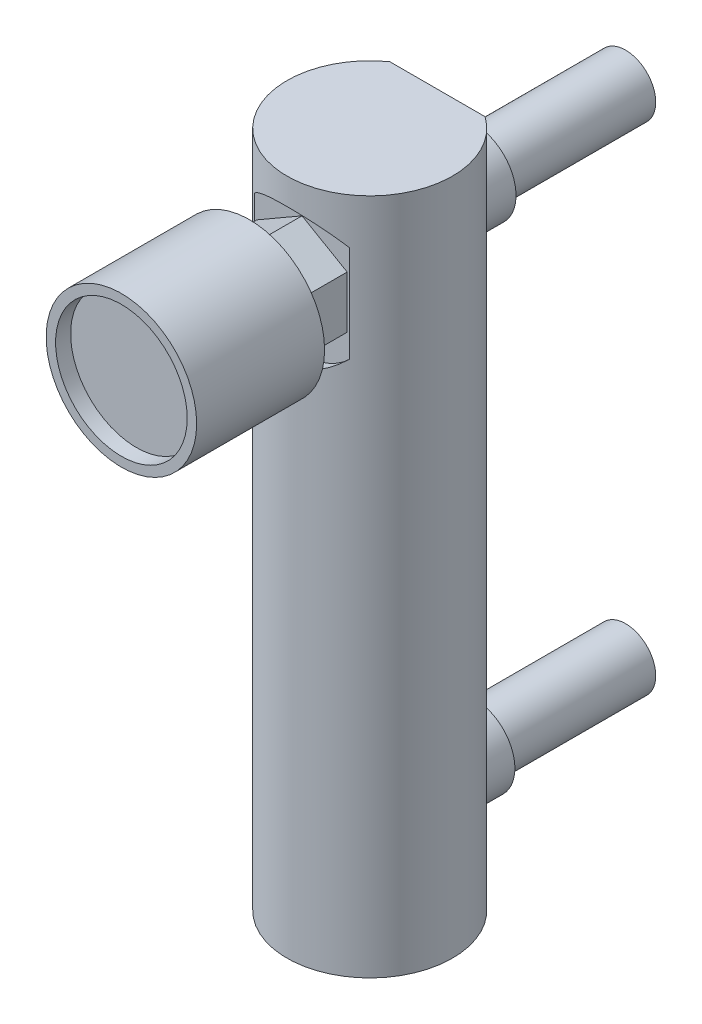
ISO-10303-21;
HEADER;
FILE_DESCRIPTION(('STEP AP214'),'2;1');
FILE_NAME('part.step','',(''),(''),'','','');
FILE_SCHEMA(('AUTOMOTIVE_DESIGN { 1 0 10303 214 1 1 1 1 }'));
ENDSEC;
DATA;
#1=APPLICATION_CONTEXT('core data for automotive mechanical design processes');
#2=APPLICATION_PROTOCOL_DEFINITION('international standard','automotive_design',2000,#1);
#3=PRODUCT_CONTEXT('',#1,'mechanical');
#4=PRODUCT('Part','Part','',(#3));
#5=PRODUCT_RELATED_PRODUCT_CATEGORY('part','',(#4));
#6=PRODUCT_DEFINITION_FORMATION('','',#4);
#7=PRODUCT_DEFINITION_CONTEXT('part definition',#1,'design');
#8=PRODUCT_DEFINITION('design','',#6,#7);
#9=PRODUCT_DEFINITION_SHAPE('','',#8);
#10=(LENGTH_UNIT() NAMED_UNIT(*) SI_UNIT(.MILLI.,.METRE.));
#11=(NAMED_UNIT(*) PLANE_ANGLE_UNIT() SI_UNIT($,.RADIAN.));
#12=(NAMED_UNIT(*) SI_UNIT($,.STERADIAN.) SOLID_ANGLE_UNIT());
#13=UNCERTAINTY_MEASURE_WITH_UNIT(LENGTH_MEASURE(1.E-05),#10,'distance_accuracy_value','');
#14=(GEOMETRIC_REPRESENTATION_CONTEXT(3) GLOBAL_UNCERTAINTY_ASSIGNED_CONTEXT((#13)) GLOBAL_UNIT_ASSIGNED_CONTEXT((#10,
#11,#12)) REPRESENTATION_CONTEXT('',''));
#15=CARTESIAN_POINT('',(0.,0.,0.));
#16=DIRECTION('',(0.,0.,1.));
#17=DIRECTION('',(1.,0.,0.));
#18=AXIS2_PLACEMENT_3D('',#15,#16,#17);
#19=CARTESIAN_POINT('',(0.,77.5,33.));
#20=DIRECTION('',(0.,0.,-1.));
#21=DIRECTION('',(-1.,0.,0.));
#22=AXIS2_PLACEMENT_3D('',#19,#20,#21);
#23=CYLINDRICAL_SURFACE('',#22,1.70074129793573);
#24=CARTESIAN_POINT('',(0.,77.5,14.));
#25=DIRECTION('',(0.,0.,1.));
#26=DIRECTION('',(1.,0.,0.));
#27=AXIS2_PLACEMENT_3D('',#24,#25,#26);
#28=CIRCLE('',#27,1.70074129793573);
#29=CARTESIAN_POINT('',(1.70074129793573,77.5,14.));
#30=VERTEX_POINT('',#29);
#31=EDGE_CURVE('E281',#30,#30,#28,.T.);
#32=ORIENTED_EDGE('',*,*,#31,.T.);
#33=EDGE_LOOP('',(#32));
#34=FACE_BOUND('',#33,.T.);
#35=CARTESIAN_POINT('',(0.,77.5,16.));
#36=DIRECTION('',(0.,0.,1.));
#37=DIRECTION('',(1.,0.,0.));
#38=AXIS2_PLACEMENT_3D('',#35,#36,#37);
#39=CIRCLE('',#38,1.70074129793573);
#40=CARTESIAN_POINT('',(1.70074129793573,77.5,16.));
#41=VERTEX_POINT('',#40);
#42=EDGE_CURVE('E11',#41,#41,#39,.T.);
#43=ORIENTED_EDGE('',*,*,#42,.F.);
#44=EDGE_LOOP('',(#43));
#45=FACE_BOUND('',#44,.T.);
#46=ADVANCED_FACE('F36',(#34,#45),#23,.T.);
#47=CARTESIAN_POINT('',(0.,0.,9.));
#48=DIRECTION('',(0.,0.,-1.));
#49=DIRECTION('',(-1.,0.,0.));
#50=AXIS2_PLACEMENT_3D('',#47,#48,#49);
#51=PLANE('',#50);
#52=CARTESIAN_POINT('',(0.,77.5,9.));
#53=DIRECTION('',(0.,0.,-1.));
#54=DIRECTION('',(-1.,0.,0.));
#55=AXIS2_PLACEMENT_3D('',#52,#53,#54);
#56=CIRCLE('',#55,9.);
#57=CARTESIAN_POINT('',(-6.32455532033675,83.9031242374328,9.));
#58=VERTEX_POINT('',#57);
#59=CARTESIAN_POINT('',(6.32455532033675,83.9031242374328,9.));
#60=VERTEX_POINT('',#59);
#61=EDGE_CURVE('E136',#58,#60,#56,.T.);
#62=ORIENTED_EDGE('',*,*,#61,.F.);
#63=DIRECTION('',(0.,-1.,0.));
#64=VECTOR('',#63,1.);
#65=CARTESIAN_POINT('',(-6.32455532033676,90.,9.));
#66=LINE('',#65,#64);
#67=CARTESIAN_POINT('',(-6.32455532033675,71.0968757625672,9.));
#68=VERTEX_POINT('',#67);
#69=EDGE_CURVE('E161',#68,#58,#66,.F.);
#70=ORIENTED_EDGE('',*,*,#69,.F.);
#71=CARTESIAN_POINT('',(6.32455532033675,71.0968757625672,9.));
#72=VERTEX_POINT('',#71);
#73=EDGE_CURVE('E139',#72,#68,#56,.T.);
#74=ORIENTED_EDGE('',*,*,#73,.F.);
#75=DIRECTION('',(0.,-1.,0.));
#76=VECTOR('',#75,1.);
#77=CARTESIAN_POINT('',(6.32455532033676,90.,9.));
#78=LINE('',#77,#76);
#79=EDGE_CURVE('E45',#60,#72,#78,.T.);
#80=ORIENTED_EDGE('',*,*,#79,.F.);
#81=EDGE_LOOP('',(#62,#70,#74,#80));
#82=FACE_BOUND('',#81,.T.);
#83=DIRECTION('',(0.866025403784438,-0.5,0.));
#84=VECTOR('',#83,1.);
#85=CARTESIAN_POINT('',(-5.99999999999999,74.0358983848622,9.));
#86=LINE('',#85,#84);
#87=CARTESIAN_POINT('',(-5.99999999999999,74.0358983848622,9.));
#88=VERTEX_POINT('',#87);
#89=CARTESIAN_POINT('',(0.,70.5717967697245,9.));
#90=VERTEX_POINT('',#89);
#91=EDGE_CURVE('E135',#88,#90,#86,.T.);
#92=ORIENTED_EDGE('',*,*,#91,.F.);
#93=DIRECTION('',(0.,-1.,0.));
#94=VECTOR('',#93,1.);
#95=CARTESIAN_POINT('',(-5.99999999999999,80.9641016151377,9.));
#96=LINE('',#95,#94);
#97=CARTESIAN_POINT('',(-5.99999999999999,80.9641016151377,9.));
#98=VERTEX_POINT('',#97);
#99=EDGE_CURVE('E132',#98,#88,#96,.T.);
#100=ORIENTED_EDGE('',*,*,#99,.F.);
#101=DIRECTION('',(-0.866025403784439,-0.5,0.));
#102=VECTOR('',#101,1.);
#103=CARTESIAN_POINT('',(0.,84.4282032302755,9.));
#104=LINE('',#103,#102);
#105=CARTESIAN_POINT('',(0.,84.4282032302755,9.));
#106=VERTEX_POINT('',#105);
#107=EDGE_CURVE('E298',#106,#98,#104,.T.);
#108=ORIENTED_EDGE('',*,*,#107,.F.);
#109=DIRECTION('',(-0.866025403784437,0.500000000000002,0.));
#110=VECTOR('',#109,1.);
#111=CARTESIAN_POINT('',(6.00000000000001,80.9641016151377,9.));
#112=LINE('',#111,#110);
#113=CARTESIAN_POINT('',(6.00000000000001,80.9641016151377,9.));
#114=VERTEX_POINT('',#113);
#115=EDGE_CURVE('E295',#114,#106,#112,.T.);
#116=ORIENTED_EDGE('',*,*,#115,.F.);
#117=DIRECTION('',(0.,1.,0.));
#118=VECTOR('',#117,1.);
#119=CARTESIAN_POINT('',(6.00000000000001,74.0358983848622,9.));
#120=LINE('',#119,#118);
#121=CARTESIAN_POINT('',(6.00000000000001,74.0358983848622,9.));
#122=VERTEX_POINT('',#121);
#123=EDGE_CURVE('E58',#122,#114,#120,.T.);
#124=ORIENTED_EDGE('',*,*,#123,.F.);
#125=DIRECTION('',(0.866025403784438,0.5,0.));
#126=VECTOR('',#125,1.);
#127=CARTESIAN_POINT('',(0.,70.5717967697245,9.));
#128=LINE('',#127,#126);
#129=EDGE_CURVE('E53',#90,#122,#128,.T.);
#130=ORIENTED_EDGE('',*,*,#129,.F.);
#131=EDGE_LOOP('',(#92,#100,#108,#116,#124,#130));
#132=FACE_BOUND('',#131,.T.);
#133=ADVANCED_FACE('F186',(#82,#132),#51,.F.);
#134=CARTESIAN_POINT('',(0.,90.,-9.));
#135=DIRECTION('',(0.,0.,-1.));
#136=DIRECTION('',(-1.,0.,0.));
#137=AXIS2_PLACEMENT_3D('',#134,#135,#136);
#138=PLANE('',#137);
#139=CARTESIAN_POINT('',(0.,12.,-9.));
#140=DIRECTION('',(0.,0.,-1.));
#141=DIRECTION('',(-1.,0.,0.));
#142=AXIS2_PLACEMENT_3D('',#139,#140,#141);
#143=CIRCLE('',#142,5.28243073755002);
#144=CARTESIAN_POINT('',(-5.28243073755002,12.,-9.));
#145=VERTEX_POINT('',#144);
#146=EDGE_CURVE('E260',#145,#145,#143,.T.);
#147=ORIENTED_EDGE('',*,*,#146,.F.);
#148=EDGE_LOOP('',(#147));
#149=FACE_BOUND('',#148,.T.);
#150=CARTESIAN_POINT('',(0.,78.,-9.));
#151=DIRECTION('',(0.,0.,-1.));
#152=DIRECTION('',(-1.,0.,0.));
#153=AXIS2_PLACEMENT_3D('',#150,#151,#152);
#154=CIRCLE('',#153,5.43607755979034);
#155=CARTESIAN_POINT('',(-5.43607755979034,78.,-9.));
#156=VERTEX_POINT('',#155);
#157=EDGE_CURVE('E253',#156,#156,#154,.T.);
#158=ORIENTED_EDGE('',*,*,#157,.F.);
#159=EDGE_LOOP('',(#158));
#160=FACE_BOUND('',#159,.T.);
#161=DIRECTION('',(1.,0.,0.));
#162=VECTOR('',#161,1.);
#163=CARTESIAN_POINT('',(0.,0.,-9.));
#164=LINE('',#163,#162);
#165=CARTESIAN_POINT('',(-6.32455532033676,0.,-9.));
#166=VERTEX_POINT('',#165);
#167=CARTESIAN_POINT('',(6.32455532033676,0.,-9.));
#168=VERTEX_POINT('',#167);
#169=EDGE_CURVE('E146',#166,#168,#164,.T.);
#170=ORIENTED_EDGE('',*,*,#169,.F.);
#171=DIRECTION('',(0.,-1.,0.));
#172=VECTOR('',#171,1.);
#173=CARTESIAN_POINT('',(-6.32455532033676,90.,-9.));
#174=LINE('',#173,#172);
#175=CARTESIAN_POINT('',(-6.32455532033676,90.,-9.));
#176=VERTEX_POINT('',#175);
#177=EDGE_CURVE('E159',#176,#166,#174,.T.);
#178=ORIENTED_EDGE('',*,*,#177,.F.);
#179=DIRECTION('',(1.,0.,0.));
#180=VECTOR('',#179,1.);
#181=CARTESIAN_POINT('',(0.,90.,-9.));
#182=LINE('',#181,#180);
#183=CARTESIAN_POINT('',(6.32455532033676,90.,-9.));
#184=VERTEX_POINT('',#183);
#185=EDGE_CURVE('E147',#176,#184,#182,.T.);
#186=ORIENTED_EDGE('',*,*,#185,.T.);
#187=DIRECTION('',(0.,-1.,0.));
#188=VECTOR('',#187,1.);
#189=CARTESIAN_POINT('',(6.32455532033676,90.,-9.));
#190=LINE('',#189,#188);
#191=EDGE_CURVE('E153',#184,#168,#190,.T.);
#192=ORIENTED_EDGE('',*,*,#191,.T.);
#193=EDGE_LOOP('',(#170,#178,#186,#192));
#194=FACE_BOUND('',#193,.T.);
#195=ADVANCED_FACE('F38',(#149,#160,#194),#138,.T.);
#196=CARTESIAN_POINT('',(0.,90.,0.));
#197=DIRECTION('',(0.,-1.,0.));
#198=DIRECTION('',(0.,0.,-1.));
#199=AXIS2_PLACEMENT_3D('',#196,#197,#198);
#200=CYLINDRICAL_SURFACE('',#199,11.);
#201=CARTESIAN_POINT('',(-6.32455532033676,83.9031242374328,9.));
#202=CARTESIAN_POINT('',(-6.16099792202239,84.0646500381271,9.1149527567644));
#203=CARTESIAN_POINT('',(-5.9905513248336,84.2206482990057,9.2280529296395));
#204=CARTESIAN_POINT('',(-5.6358308674391,84.5207940361393,9.44886429477328));
#205=CARTESIAN_POINT('',(-5.45154008821341,84.6649265453361,9.5565686158649));
#206=CARTESIAN_POINT('',(-5.06813401533391,84.9411153223446,9.76534793999119));
#207=CARTESIAN_POINT('',(-4.86892279462382,85.0730786258066,9.86637047015083));
#208=CARTESIAN_POINT('',(-4.45734462392849,85.3223991538604,10.0590087250855));
#209=CARTESIAN_POINT('',(-4.24498414003023,85.4397634733287,10.1506290153824));
#210=CARTESIAN_POINT('',(-3.84279238638233,85.6409516914412,10.3088255194684));
#211=CARTESIAN_POINT('',(-3.65479455713953,85.7271373816086,10.3770631472865));
#212=CARTESIAN_POINT('',(-3.27068656336271,85.8872452808902,10.5044528718356));
#213=CARTESIAN_POINT('',(-3.07457799041388,85.9611698818876,10.5636067404516));
#214=CARTESIAN_POINT('',(-2.67568550744164,86.0956314028537,10.6716109427674));
#215=CARTESIAN_POINT('',(-2.47292138313573,86.1562044885793,10.7204890936488));
#216=CARTESIAN_POINT('',(-2.06138944395414,86.2633255086299,10.8071681250008));
#217=CARTESIAN_POINT('',(-1.85262171112399,86.3098736345208,10.8449691567727));
#218=CARTESIAN_POINT('',(-1.42911185192056,86.3884377764702,10.908886289247));
#219=CARTESIAN_POINT('',(-1.21433906259267,86.4203543087361,10.9349223806055));
#220=CARTESIAN_POINT('',(-0.781886375974804,86.4686111168654,10.974324160487));
#221=CARTESIAN_POINT('',(-0.564206448053663,86.4849512284757,10.9876897153994));
#222=CARTESIAN_POINT('',(-0.127734692394787,86.5017443399505,11.0014261712244));
#223=CARTESIAN_POINT('',(0.0910575508762826,86.5021908872347,11.0017917943338));
#224=CARTESIAN_POINT('',(0.527715897361066,86.4871703971651,10.989504652687));
#225=CARTESIAN_POINT('',(0.745582062901418,86.4717044483391,10.9768527784201));
#226=CARTESIAN_POINT('',(1.15766475252409,86.4274040860036,10.9406763706318));
#227=CARTESIAN_POINT('',(1.35214036040209,86.3999986527413,10.9183147143817));
#228=CARTESIAN_POINT('',(1.73759036146071,86.3328399262775,10.8636402958869));
#229=CARTESIAN_POINT('',(1.92856355927066,86.2930824974499,10.8313242007837));
#230=CARTESIAN_POINT('',(2.30571796531076,86.201798467465,10.7573501442946));
#231=CARTESIAN_POINT('',(2.49190134961654,86.1502773196678,10.7156965117154));
#232=CARTESIAN_POINT('',(2.85868599828035,86.0360898079221,10.6237321367992));
#233=CARTESIAN_POINT('',(3.03928515099733,85.9734192869738,10.5734181657174));
#234=CARTESIAN_POINT('',(3.40395429112135,85.8338641389887,10.4619038101832));
#235=CARTESIAN_POINT('',(3.58765832300762,85.7563826672079,10.4002534770157));
#236=CARTESIAN_POINT('',(3.94727908985638,85.5906267908345,10.2691615662262));
#237=CARTESIAN_POINT('',(4.12319264125593,85.5023480283869,10.1997168436763));
#238=CARTESIAN_POINT('',(4.63854746809818,85.2224720879242,9.98112766629912));
#239=CARTESIAN_POINT('',(4.96567833931867,85.0158059241233,9.82170449563356));
#240=CARTESIAN_POINT('',(5.46341011332031,84.6558007556056,9.54973793050828));
#241=CARTESIAN_POINT('',(5.64529552947393,84.5131041723977,9.44316406127798));
#242=CARTESIAN_POINT('',(5.99514304337773,84.216433035151,9.22499575093645));
#243=CARTESIAN_POINT('',(6.16315006791983,84.0624981767839,9.11341947153541));
#244=CARTESIAN_POINT('',(6.32455532033676,83.9031242374328,9.));
#245=B_SPLINE_CURVE_WITH_KNOTS('',3,(#201,#202,#203,#204,#205,#206,#207,#208,#209,#210,#211,
#212,#213,#214,#215,#216,#217,#218,#219,#220,#221,#222,#223,#224,#225,#226,#227,#228,#229,#230,
#231,#232,#233,#234,#235,#236,#237,#238,#239,#240,#241,#242,#243,#244),.UNSPECIFIED.,.F.,.F.,(4,
2,2,2,2,2,2,2,2,2,2,2,2,2,2,2,2,2,2,2,2,4),(0.,0.771004755906313,1.54296758773714,
2.32040902248742,3.09747114442565,3.75017448449894,4.40275034559277,5.053536213209,
5.70431319138528,6.35945162532142,7.01459696760122,7.67000828732936,8.32537477524818,
8.91770281623892,9.51022939130118,10.1024818418375,10.6949555759146,11.3203935568971,
11.9460848068177,13.1972165927808,13.9603363560682,14.7208801464933),.UNSPECIFIED.);
#246=EDGE_CURVE('E164',#58,#60,#245,.T.);
#247=ORIENTED_EDGE('',*,*,#246,.T.);
#248=ORIENTED_EDGE('',*,*,#79,.T.);
#249=CARTESIAN_POINT('',(6.32455532033676,71.0968757625672,9.));
#250=CARTESIAN_POINT('',(6.16099792202239,70.9353499618729,9.1149527567644));
#251=CARTESIAN_POINT('',(5.99055132483361,70.7793517009943,9.2280529296395));
#252=CARTESIAN_POINT('',(5.6358308674391,70.4792059638607,9.44886429477328));
#253=CARTESIAN_POINT('',(5.45154008821341,70.3350734546639,9.5565686158649));
#254=CARTESIAN_POINT('',(5.06813401533391,70.0588846776554,9.76534793999119));
#255=CARTESIAN_POINT('',(4.86892279462383,69.9269213741934,9.86637047015083));
#256=CARTESIAN_POINT('',(4.45734462392849,69.6776008461396,10.0590087250855));
#257=CARTESIAN_POINT('',(4.24498414003023,69.5602365266713,10.1506290153824));
#258=CARTESIAN_POINT('',(3.84279238638233,69.3590483085588,10.3088255194684));
#259=CARTESIAN_POINT('',(3.65479455713953,69.2728626183914,10.3770631472865));
#260=CARTESIAN_POINT('',(3.27068656336271,69.1127547191098,10.5044528718356));
#261=CARTESIAN_POINT('',(3.07457799041388,69.0388301181124,10.5636067404516));
#262=CARTESIAN_POINT('',(2.67568550744164,68.9043685971463,10.6716109427674));
#263=CARTESIAN_POINT('',(2.47292138313573,68.8437955114207,10.7204890936488));
#264=CARTESIAN_POINT('',(2.06138944395414,68.7366744913701,10.8071681250008));
#265=CARTESIAN_POINT('',(1.85262171112399,68.6901263654792,10.8449691567727));
#266=CARTESIAN_POINT('',(1.42911185192056,68.6115622235298,10.908886289247));
#267=CARTESIAN_POINT('',(1.21433906259267,68.5796456912639,10.9349223806055));
#268=CARTESIAN_POINT('',(0.781886375974803,68.5313888831346,10.974324160487));
#269=CARTESIAN_POINT('',(0.564206448053661,68.5150487715243,10.9876897153994));
#270=CARTESIAN_POINT('',(0.127734692394786,68.4982556600495,11.0014261712244));
#271=CARTESIAN_POINT('',(-0.0910575508762844,68.4978091127653,11.0017917943338));
#272=CARTESIAN_POINT('',(-0.527715897361068,68.5128296028349,10.989504652687));
#273=CARTESIAN_POINT('',(-0.74558206290142,68.5282955516609,10.9768527784201));
#274=CARTESIAN_POINT('',(-1.15766475252409,68.5725959139964,10.9406763706318));
#275=CARTESIAN_POINT('',(-1.35214036040209,68.6000013472587,10.9183147143817));
#276=CARTESIAN_POINT('',(-1.73759036146071,68.6671600737225,10.8636402958869));
#277=CARTESIAN_POINT('',(-1.92856355927067,68.7069175025501,10.8313242007836));
#278=CARTESIAN_POINT('',(-2.30571796531077,68.798201532535,10.7573501442945));
#279=CARTESIAN_POINT('',(-2.49190134961654,68.8497226803322,10.7156965117154));
#280=CARTESIAN_POINT('',(-2.85868599828035,68.9639101920779,10.6237321367992));
#281=CARTESIAN_POINT('',(-3.03928515099733,69.0265807130262,10.5734181657174));
#282=CARTESIAN_POINT('',(-3.40395429112135,69.1661358610113,10.4619038101832));
#283=CARTESIAN_POINT('',(-3.58765832300763,69.2436173327921,10.4002534770157));
#284=CARTESIAN_POINT('',(-3.94727908985638,69.4093732091655,10.2691615662262));
#285=CARTESIAN_POINT('',(-4.12319264125593,69.4976519716131,10.1997168436763));
#286=CARTESIAN_POINT('',(-4.63854746809818,69.7775279120758,9.98112766629912));
#287=CARTESIAN_POINT('',(-4.96567833931867,69.9841940758767,9.82170449563356));
#288=CARTESIAN_POINT('',(-5.46341011332031,70.3441992443944,9.54973793050828));
#289=CARTESIAN_POINT('',(-5.64529552947393,70.4868958276023,9.44316406127798));
#290=CARTESIAN_POINT('',(-5.99514304337773,70.783566964849,9.22499575093645));
#291=CARTESIAN_POINT('',(-6.16315006791983,70.9375018232161,9.11341947153541));
#292=CARTESIAN_POINT('',(-6.32455532033676,71.0968757625672,9.));
#293=B_SPLINE_CURVE_WITH_KNOTS('',3,(#249,#250,#251,#252,#253,#254,#255,#256,#257,#258,#259,
#260,#261,#262,#263,#264,#265,#266,#267,#268,#269,#270,#271,#272,#273,#274,#275,#276,#277,#278,
#279,#280,#281,#282,#283,#284,#285,#286,#287,#288,#289,#290,#291,#292),.UNSPECIFIED.,.F.,.F.,(4,
2,2,2,2,2,2,2,2,2,2,2,2,2,2,2,2,2,2,2,2,4),(0.,0.771004755906313,1.54296758773714,
2.32040902248742,3.09747114442565,3.75017448449894,4.40275034559277,5.053536213209,
5.70431319138528,6.35945162532142,7.01459696760122,7.67000828732936,8.32537477524818,
8.91770281623892,9.51022939130118,10.1024818418375,10.6949555759146,11.3203935568971,
11.9460848068177,13.1972165927808,13.9603363560682,14.7208801464933),.UNSPECIFIED.);
#294=EDGE_CURVE('E170',#72,#68,#293,.T.);
#295=ORIENTED_EDGE('',*,*,#294,.T.);
#296=ORIENTED_EDGE('',*,*,#69,.T.);
#297=EDGE_LOOP('',(#247,#248,#295,#296));
#298=FACE_BOUND('',#297,.T.);
#299=CARTESIAN_POINT('',(0.,0.,0.));
#300=DIRECTION('',(0.,1.,0.));
#301=DIRECTION('',(0.,0.,1.));
#302=AXIS2_PLACEMENT_3D('',#299,#300,#301);
#303=CIRCLE('',#302,11.);
#304=EDGE_CURVE('E151',#166,#168,#303,.T.);
#305=ORIENTED_EDGE('',*,*,#304,.T.);
#306=ORIENTED_EDGE('',*,*,#191,.F.);
#307=CARTESIAN_POINT('',(0.,90.,0.));
#308=DIRECTION('',(0.,1.,0.));
#309=DIRECTION('',(0.,0.,1.));
#310=AXIS2_PLACEMENT_3D('',#307,#308,#309);
#311=CIRCLE('',#310,11.);
#312=EDGE_CURVE('E150',#176,#184,#311,.T.);
#313=ORIENTED_EDGE('',*,*,#312,.F.);
#314=ORIENTED_EDGE('',*,*,#177,.T.);
#315=EDGE_LOOP('',(#305,#306,#313,#314));
#316=FACE_BOUND('',#315,.T.);
#317=ADVANCED_FACE('F175',(#298,#316),#200,.T.);
#318=CARTESIAN_POINT('',(0.,90.,0.));
#319=DIRECTION('',(0.,1.,0.));
#320=DIRECTION('',(0.,0.,1.));
#321=AXIS2_PLACEMENT_3D('',#318,#319,#320);
#322=PLANE('',#321);
#323=ORIENTED_EDGE('',*,*,#185,.F.);
#324=ORIENTED_EDGE('',*,*,#312,.T.);
#325=EDGE_LOOP('',(#323,#324));
#326=FACE_BOUND('',#325,.T.);
#327=ADVANCED_FACE('F188',(#326),#322,.T.);
#328=CARTESIAN_POINT('',(0.,0.,0.));
#329=DIRECTION('',(0.,1.,0.));
#330=DIRECTION('',(0.,0.,1.));
#331=AXIS2_PLACEMENT_3D('',#328,#329,#330);
#332=PLANE('',#331);
#333=ORIENTED_EDGE('',*,*,#169,.T.);
#334=ORIENTED_EDGE('',*,*,#304,.F.);
#335=EDGE_LOOP('',(#333,#334));
#336=FACE_BOUND('',#335,.T.);
#337=ADVANCED_FACE('F184',(#336),#332,.F.);
#338=CARTESIAN_POINT('',(0.,77.5,11.));
#339=DIRECTION('',(0.,0.,-1.));
#340=DIRECTION('',(-1.,0.,0.));
#341=AXIS2_PLACEMENT_3D('',#338,#339,#340);
#342=CYLINDRICAL_SURFACE('',#341,9.);
#343=ORIENTED_EDGE('',*,*,#73,.T.);
#344=ORIENTED_EDGE('',*,*,#294,.F.);
#345=EDGE_LOOP('',(#343,#344));
#346=FACE_BOUND('',#345,.T.);
#347=ADVANCED_FACE('F178',(#346),#342,.F.);
#348=ORIENTED_EDGE('',*,*,#61,.T.);
#349=ORIENTED_EDGE('',*,*,#246,.F.);
#350=EDGE_LOOP('',(#348,#349));
#351=FACE_BOUND('',#350,.T.);
#352=ADVANCED_FACE('F183',(#351),#342,.F.);
#353=CARTESIAN_POINT('',(-5.99999999999999,74.0358983848622,14.));
#354=DIRECTION('',(0.5,0.866025403784439,0.));
#355=DIRECTION('',(-0.866025403784439,0.5,0.));
#356=AXIS2_PLACEMENT_3D('',#353,#354,#355);
#357=PLANE('',#356);
#358=ORIENTED_EDGE('',*,*,#91,.T.);
#359=DIRECTION('',(0.,0.,-1.));
#360=VECTOR('',#359,1.);
#361=CARTESIAN_POINT('',(0.,70.5717967697245,14.));
#362=LINE('',#361,#360);
#363=CARTESIAN_POINT('',(0.,70.5717967697245,14.));
#364=VERTEX_POINT('',#363);
#365=EDGE_CURVE('E116',#364,#90,#362,.T.);
#366=ORIENTED_EDGE('',*,*,#365,.F.);
#367=DIRECTION('',(0.866025403784438,-0.5,0.));
#368=VECTOR('',#367,1.);
#369=CARTESIAN_POINT('',(-5.99999999999999,74.0358983848622,14.));
#370=LINE('',#369,#368);
#371=CARTESIAN_POINT('',(-5.99999999999999,74.0358983848622,14.));
#372=VERTEX_POINT('',#371);
#373=EDGE_CURVE('E123',#372,#364,#370,.T.);
#374=ORIENTED_EDGE('',*,*,#373,.F.);
#375=DIRECTION('',(0.,0.,-1.));
#376=VECTOR('',#375,1.);
#377=CARTESIAN_POINT('',(-5.99999999999999,74.0358983848622,14.));
#378=LINE('',#377,#376);
#379=EDGE_CURVE('E291',#372,#88,#378,.T.);
#380=ORIENTED_EDGE('',*,*,#379,.T.);
#381=EDGE_LOOP('',(#358,#366,#374,#380));
#382=FACE_BOUND('',#381,.T.);
#383=ADVANCED_FACE('F134',(#382),#357,.F.);
#384=CARTESIAN_POINT('',(0.,70.5717967697245,14.));
#385=DIRECTION('',(-0.5,0.866025403784438,0.));
#386=DIRECTION('',(-0.866025403784438,-0.5,0.));
#387=AXIS2_PLACEMENT_3D('',#384,#385,#386);
#388=PLANE('',#387);
#389=ORIENTED_EDGE('',*,*,#129,.T.);
#390=DIRECTION('',(0.,0.,-1.));
#391=VECTOR('',#390,1.);
#392=CARTESIAN_POINT('',(6.00000000000001,74.0358983848622,14.));
#393=LINE('',#392,#391);
#394=CARTESIAN_POINT('',(6.00000000000001,74.0358983848622,14.));
#395=VERTEX_POINT('',#394);
#396=EDGE_CURVE('E119',#395,#122,#393,.T.);
#397=ORIENTED_EDGE('',*,*,#396,.F.);
#398=DIRECTION('',(0.866025403784438,0.5,0.));
#399=VECTOR('',#398,1.);
#400=CARTESIAN_POINT('',(0.,70.5717967697245,14.));
#401=LINE('',#400,#399);
#402=EDGE_CURVE('E112',#364,#395,#401,.T.);
#403=ORIENTED_EDGE('',*,*,#402,.F.);
#404=ORIENTED_EDGE('',*,*,#365,.T.);
#405=EDGE_LOOP('',(#389,#397,#403,#404));
#406=FACE_BOUND('',#405,.T.);
#407=ADVANCED_FACE('F114',(#406),#388,.F.);
#408=CARTESIAN_POINT('',(6.00000000000001,74.0358983848622,14.));
#409=DIRECTION('',(-1.,0.,0.));
#410=DIRECTION('',(0.,0.,1.));
#411=AXIS2_PLACEMENT_3D('',#408,#409,#410);
#412=PLANE('',#411);
#413=ORIENTED_EDGE('',*,*,#123,.T.);
#414=DIRECTION('',(0.,0.,-1.));
#415=VECTOR('',#414,1.);
#416=CARTESIAN_POINT('',(6.00000000000001,80.9641016151377,14.));
#417=LINE('',#416,#415);
#418=CARTESIAN_POINT('',(6.00000000000001,80.9641016151377,14.));
#419=VERTEX_POINT('',#418);
#420=EDGE_CURVE('E141',#419,#114,#417,.T.);
#421=ORIENTED_EDGE('',*,*,#420,.F.);
#422=DIRECTION('',(0.,1.,0.));
#423=VECTOR('',#422,1.);
#424=CARTESIAN_POINT('',(6.00000000000001,74.0358983848622,14.));
#425=LINE('',#424,#423);
#426=EDGE_CURVE('E122',#395,#419,#425,.T.);
#427=ORIENTED_EDGE('',*,*,#426,.F.);
#428=ORIENTED_EDGE('',*,*,#396,.T.);
#429=EDGE_LOOP('',(#413,#421,#427,#428));
#430=FACE_BOUND('',#429,.T.);
#431=ADVANCED_FACE('F224',(#430),#412,.F.);
#432=CARTESIAN_POINT('',(6.00000000000001,80.9641016151377,14.));
#433=DIRECTION('',(-0.500000000000002,-0.866025403784437,0.));
#434=DIRECTION('',(0.866025403784437,-0.500000000000002,0.));
#435=AXIS2_PLACEMENT_3D('',#432,#433,#434);
#436=PLANE('',#435);
#437=ORIENTED_EDGE('',*,*,#115,.T.);
#438=DIRECTION('',(0.,0.,-1.));
#439=VECTOR('',#438,1.);
#440=CARTESIAN_POINT('',(0.,84.4282032302755,14.));
#441=LINE('',#440,#439);
#442=CARTESIAN_POINT('',(0.,84.4282032302755,14.));
#443=VERTEX_POINT('',#442);
#444=EDGE_CURVE('E307',#443,#106,#441,.T.);
#445=ORIENTED_EDGE('',*,*,#444,.F.);
#446=DIRECTION('',(-0.866025403784437,0.500000000000002,0.));
#447=VECTOR('',#446,1.);
#448=CARTESIAN_POINT('',(6.00000000000001,80.9641016151377,14.));
#449=LINE('',#448,#447);
#450=EDGE_CURVE('E286',#419,#443,#449,.T.);
#451=ORIENTED_EDGE('',*,*,#450,.F.);
#452=ORIENTED_EDGE('',*,*,#420,.T.);
#453=EDGE_LOOP('',(#437,#445,#451,#452));
#454=FACE_BOUND('',#453,.T.);
#455=ADVANCED_FACE('F220',(#454),#436,.F.);
#456=CARTESIAN_POINT('',(0.,84.4282032302755,14.));
#457=DIRECTION('',(0.5,-0.866025403784439,0.));
#458=DIRECTION('',(0.866025403784439,0.5,0.));
#459=AXIS2_PLACEMENT_3D('',#456,#457,#458);
#460=PLANE('',#459);
#461=ORIENTED_EDGE('',*,*,#107,.T.);
#462=DIRECTION('',(0.,0.,-1.));
#463=VECTOR('',#462,1.);
#464=CARTESIAN_POINT('',(-5.99999999999999,80.9641016151377,14.));
#465=LINE('',#464,#463);
#466=CARTESIAN_POINT('',(-5.99999999999999,80.9641016151377,14.));
#467=VERTEX_POINT('',#466);
#468=EDGE_CURVE('E304',#467,#98,#465,.T.);
#469=ORIENTED_EDGE('',*,*,#468,.F.);
#470=DIRECTION('',(-0.866025403784439,-0.5,0.));
#471=VECTOR('',#470,1.);
#472=CARTESIAN_POINT('',(0.,84.4282032302755,14.));
#473=LINE('',#472,#471);
#474=EDGE_CURVE('E288',#443,#467,#473,.T.);
#475=ORIENTED_EDGE('',*,*,#474,.F.);
#476=ORIENTED_EDGE('',*,*,#444,.T.);
#477=EDGE_LOOP('',(#461,#469,#475,#476));
#478=FACE_BOUND('',#477,.T.);
#479=ADVANCED_FACE('F216',(#478),#460,.F.);
#480=CARTESIAN_POINT('',(-5.99999999999999,80.9641016151377,14.));
#481=DIRECTION('',(1.,0.,0.));
#482=DIRECTION('',(0.,0.,-1.));
#483=AXIS2_PLACEMENT_3D('',#480,#481,#482);
#484=PLANE('',#483);
#485=ORIENTED_EDGE('',*,*,#99,.T.);
#486=ORIENTED_EDGE('',*,*,#379,.F.);
#487=DIRECTION('',(0.,-1.,0.));
#488=VECTOR('',#487,1.);
#489=CARTESIAN_POINT('',(-5.99999999999999,80.9641016151377,14.));
#490=LINE('',#489,#488);
#491=EDGE_CURVE('E128',#467,#372,#490,.T.);
#492=ORIENTED_EDGE('',*,*,#491,.F.);
#493=ORIENTED_EDGE('',*,*,#468,.T.);
#494=EDGE_LOOP('',(#485,#486,#492,#493));
#495=FACE_BOUND('',#494,.T.);
#496=ADVANCED_FACE('F212',(#495),#484,.F.);
#497=CARTESIAN_POINT('',(0.,0.,14.));
#498=DIRECTION('',(0.,0.,1.));
#499=DIRECTION('',(1.,0.,0.));
#500=AXIS2_PLACEMENT_3D('',#497,#498,#499);
#501=PLANE('',#500);
#502=ORIENTED_EDGE('',*,*,#31,.F.);
#503=EDGE_LOOP('',(#502));
#504=FACE_BOUND('',#503,.T.);
#505=ORIENTED_EDGE('',*,*,#373,.T.);
#506=ORIENTED_EDGE('',*,*,#402,.T.);
#507=ORIENTED_EDGE('',*,*,#426,.T.);
#508=ORIENTED_EDGE('',*,*,#450,.T.);
#509=ORIENTED_EDGE('',*,*,#474,.T.);
#510=ORIENTED_EDGE('',*,*,#491,.T.);
#511=EDGE_LOOP('',(#505,#506,#507,#508,#509,#510));
#512=FACE_BOUND('',#511,.T.);
#513=ADVANCED_FACE('F126',(#504,#512),#501,.T.);
#514=CARTESIAN_POINT('',(0.,77.5,16.));
#515=DIRECTION('',(0.,0.,1.));
#516=DIRECTION('',(1.,0.,0.));
#517=AXIS2_PLACEMENT_3D('',#514,#515,#516);
#518=CYLINDRICAL_SURFACE('',#517,10.);
#519=CARTESIAN_POINT('',(0.,77.5,16.));
#520=DIRECTION('',(0.,0.,1.));
#521=DIRECTION('',(1.,0.,0.));
#522=AXIS2_PLACEMENT_3D('',#519,#520,#521);
#523=CIRCLE('',#522,10.);
#524=CARTESIAN_POINT('',(10.,77.5,16.));
#525=VERTEX_POINT('',#524);
#526=EDGE_CURVE('E278',#525,#525,#523,.T.);
#527=ORIENTED_EDGE('',*,*,#526,.T.);
#528=EDGE_LOOP('',(#527));
#529=FACE_BOUND('',#528,.T.);
#530=CARTESIAN_POINT('',(0.,77.5,33.));
#531=DIRECTION('',(0.,0.,1.));
#532=DIRECTION('',(1.,0.,0.));
#533=AXIS2_PLACEMENT_3D('',#530,#531,#532);
#534=CIRCLE('',#533,10.);
#535=CARTESIAN_POINT('',(10.,77.5,33.));
#536=VERTEX_POINT('',#535);
#537=EDGE_CURVE('E275',#536,#536,#534,.T.);
#538=ORIENTED_EDGE('',*,*,#537,.F.);
#539=EDGE_LOOP('',(#538));
#540=FACE_BOUND('',#539,.T.);
#541=ADVANCED_FACE('F211',(#529,#540),#518,.T.);
#542=CARTESIAN_POINT('',(0.,77.5,16.));
#543=DIRECTION('',(0.,0.,1.));
#544=DIRECTION('',(1.,0.,0.));
#545=AXIS2_PLACEMENT_3D('',#542,#543,#544);
#546=PLANE('',#545);
#547=ORIENTED_EDGE('',*,*,#42,.T.);
#548=EDGE_LOOP('',(#547));
#549=FACE_BOUND('',#548,.T.);
#550=ORIENTED_EDGE('',*,*,#526,.F.);
#551=EDGE_LOOP('',(#550));
#552=FACE_BOUND('',#551,.T.);
#553=ADVANCED_FACE('F320',(#549,#552),#546,.F.);
#554=CARTESIAN_POINT('',(0.,77.5,33.));
#555=DIRECTION('',(0.,0.,1.));
#556=DIRECTION('',(1.,0.,0.));
#557=AXIS2_PLACEMENT_3D('',#554,#555,#556);
#558=PLANE('',#557);
#559=CARTESIAN_POINT('',(0.,77.5,33.));
#560=DIRECTION('',(0.,0.,1.));
#561=DIRECTION('',(1.,0.,0.));
#562=AXIS2_PLACEMENT_3D('',#559,#560,#561);
#563=CIRCLE('',#562,8.74505734942089);
#564=CARTESIAN_POINT('',(8.74505734942089,77.5,33.));
#565=VERTEX_POINT('',#564);
#566=EDGE_CURVE('E269',#565,#565,#563,.T.);
#567=ORIENTED_EDGE('',*,*,#566,.F.);
#568=EDGE_LOOP('',(#567));
#569=FACE_BOUND('',#568,.T.);
#570=ORIENTED_EDGE('',*,*,#537,.T.);
#571=EDGE_LOOP('',(#570));
#572=FACE_BOUND('',#571,.T.);
#573=ADVANCED_FACE('F207',(#569,#572),#558,.T.);
#574=CARTESIAN_POINT('',(0.,77.5,31.));
#575=DIRECTION('',(0.,0.,1.));
#576=DIRECTION('',(1.,0.,0.));
#577=AXIS2_PLACEMENT_3D('',#574,#575,#576);
#578=CYLINDRICAL_SURFACE('',#577,8.74505734942089);
#579=CARTESIAN_POINT('',(0.,77.5,31.));
#580=DIRECTION('',(0.,0.,1.));
#581=DIRECTION('',(1.,0.,0.));
#582=AXIS2_PLACEMENT_3D('',#579,#580,#581);
#583=CIRCLE('',#582,8.74505734942089);
#584=CARTESIAN_POINT('',(8.74505734942089,77.5,31.));
#585=VERTEX_POINT('',#584);
#586=EDGE_CURVE('E272',#585,#585,#583,.T.);
#587=ORIENTED_EDGE('',*,*,#586,.F.);
#588=EDGE_LOOP('',(#587));
#589=FACE_BOUND('',#588,.T.);
#590=ORIENTED_EDGE('',*,*,#566,.T.);
#591=EDGE_LOOP('',(#590));
#592=FACE_BOUND('',#591,.T.);
#593=ADVANCED_FACE('F328',(#589,#592),#578,.F.);
#594=CARTESIAN_POINT('',(0.,77.5,31.));
#595=DIRECTION('',(0.,0.,1.));
#596=DIRECTION('',(1.,0.,0.));
#597=AXIS2_PLACEMENT_3D('',#594,#595,#596);
#598=PLANE('',#597);
#599=ORIENTED_EDGE('',*,*,#586,.T.);
#600=EDGE_LOOP('',(#599));
#601=FACE_BOUND('',#600,.T.);
#602=ADVANCED_FACE('F331',(#601),#598,.T.);
#603=CARTESIAN_POINT('',(0.,78.,-14.));
#604=DIRECTION('',(0.,0.,1.));
#605=DIRECTION('',(1.,0.,0.));
#606=AXIS2_PLACEMENT_3D('',#603,#604,#605);
#607=CYLINDRICAL_SURFACE('',#606,5.43607755979034);
#608=CARTESIAN_POINT('',(0.,78.,-14.));
#609=DIRECTION('',(0.,0.,-1.));
#610=DIRECTION('',(-1.,0.,0.));
#611=AXIS2_PLACEMENT_3D('',#608,#609,#610);
#612=CIRCLE('',#611,5.43607755979034);
#613=CARTESIAN_POINT('',(-5.43607755979034,78.,-14.));
#614=VERTEX_POINT('',#613);
#615=EDGE_CURVE('E246',#614,#614,#612,.T.);
#616=ORIENTED_EDGE('',*,*,#615,.F.);
#617=EDGE_LOOP('',(#616));
#618=FACE_BOUND('',#617,.T.);
#619=ORIENTED_EDGE('',*,*,#157,.T.);
#620=EDGE_LOOP('',(#619));
#621=FACE_BOUND('',#620,.T.);
#622=ADVANCED_FACE('F335',(#618,#621),#607,.T.);
#623=CARTESIAN_POINT('',(0.,78.,-14.));
#624=DIRECTION('',(0.,0.,-1.));
#625=DIRECTION('',(-1.,0.,0.));
#626=AXIS2_PLACEMENT_3D('',#623,#624,#625);
#627=PLANE('',#626);
#628=CARTESIAN_POINT('',(0.,78.,-14.));
#629=DIRECTION('',(0.,0.,-1.));
#630=DIRECTION('',(-1.,0.,0.));
#631=AXIS2_PLACEMENT_3D('',#628,#629,#630);
#632=CIRCLE('',#631,4.);
#633=CARTESIAN_POINT('',(-4.,78.,-14.));
#634=VERTEX_POINT('',#633);
#635=EDGE_CURVE('E243',#634,#634,#632,.T.);
#636=ORIENTED_EDGE('',*,*,#635,.F.);
#637=EDGE_LOOP('',(#636));
#638=FACE_BOUND('',#637,.T.);
#639=ORIENTED_EDGE('',*,*,#615,.T.);
#640=EDGE_LOOP('',(#639));
#641=FACE_BOUND('',#640,.T.);
#642=ADVANCED_FACE('F357',(#638,#641),#627,.T.);
#643=CARTESIAN_POINT('',(0.,78.,-34.));
#644=DIRECTION('',(0.,0.,-1.));
#645=DIRECTION('',(-1.,0.,0.));
#646=AXIS2_PLACEMENT_3D('',#643,#644,#645);
#647=PLANE('',#646);
#648=CARTESIAN_POINT('',(0.,78.,-34.));
#649=DIRECTION('',(0.,0.,-1.));
#650=DIRECTION('',(-1.,0.,0.));
#651=AXIS2_PLACEMENT_3D('',#648,#649,#650);
#652=CIRCLE('',#651,4.);
#653=CARTESIAN_POINT('',(-4.,78.,-34.));
#654=VERTEX_POINT('',#653);
#655=EDGE_CURVE('E250',#654,#654,#652,.T.);
#656=ORIENTED_EDGE('',*,*,#655,.T.);
#657=EDGE_LOOP('',(#656));
#658=FACE_BOUND('',#657,.T.);
#659=ADVANCED_FACE('F354',(#658),#647,.T.);
#660=CARTESIAN_POINT('',(0.,78.,-34.));
#661=DIRECTION('',(0.,0.,1.));
#662=DIRECTION('',(1.,0.,0.));
#663=AXIS2_PLACEMENT_3D('',#660,#661,#662);
#664=CYLINDRICAL_SURFACE('',#663,4.);
#665=ORIENTED_EDGE('',*,*,#635,.T.);
#666=EDGE_LOOP('',(#665));
#667=FACE_BOUND('',#666,.T.);
#668=ORIENTED_EDGE('',*,*,#655,.F.);
#669=EDGE_LOOP('',(#668));
#670=FACE_BOUND('',#669,.T.);
#671=ADVANCED_FACE('F350',(#667,#670),#664,.T.);
#672=CARTESIAN_POINT('',(0.,12.,-14.));
#673=DIRECTION('',(0.,0.,1.));
#674=DIRECTION('',(1.,0.,0.));
#675=AXIS2_PLACEMENT_3D('',#672,#673,#674);
#676=CYLINDRICAL_SURFACE('',#675,5.28243073755002);
#677=CARTESIAN_POINT('',(0.,12.,-14.));
#678=DIRECTION('',(0.,0.,-1.));
#679=DIRECTION('',(-1.,0.,0.));
#680=AXIS2_PLACEMENT_3D('',#677,#678,#679);
#681=CIRCLE('',#680,5.28243073755002);
#682=CARTESIAN_POINT('',(-5.28243073755002,12.,-14.));
#683=VERTEX_POINT('',#682);
#684=EDGE_CURVE('E386',#683,#683,#681,.T.);
#685=ORIENTED_EDGE('',*,*,#684,.F.);
#686=EDGE_LOOP('',(#685));
#687=FACE_BOUND('',#686,.T.);
#688=ORIENTED_EDGE('',*,*,#146,.T.);
#689=EDGE_LOOP('',(#688));
#690=FACE_BOUND('',#689,.T.);
#691=ADVANCED_FACE('F353',(#687,#690),#676,.T.);
#692=CARTESIAN_POINT('',(0.,12.,-14.));
#693=DIRECTION('',(0.,0.,-1.));
#694=DIRECTION('',(-1.,0.,0.));
#695=AXIS2_PLACEMENT_3D('',#692,#693,#694);
#696=PLANE('',#695);
#697=CARTESIAN_POINT('',(0.,12.,-14.));
#698=DIRECTION('',(0.,0.,-1.));
#699=DIRECTION('',(-1.,0.,0.));
#700=AXIS2_PLACEMENT_3D('',#697,#698,#699);
#701=CIRCLE('',#700,4.);
#702=CARTESIAN_POINT('',(-4.,12.,-14.));
#703=VERTEX_POINT('',#702);
#704=EDGE_CURVE('E40',#703,#703,#701,.T.);
#705=ORIENTED_EDGE('',*,*,#704,.F.);
#706=EDGE_LOOP('',(#705));
#707=FACE_BOUND('',#706,.T.);
#708=ORIENTED_EDGE('',*,*,#684,.T.);
#709=EDGE_LOOP('',(#708));
#710=FACE_BOUND('',#709,.T.);
#711=ADVANCED_FACE('F366',(#707,#710),#696,.T.);
#712=CARTESIAN_POINT('',(0.,12.,-34.));
#713=DIRECTION('',(0.,0.,1.));
#714=DIRECTION('',(1.,0.,0.));
#715=AXIS2_PLACEMENT_3D('',#712,#713,#714);
#716=PLANE('',#715);
#717=CARTESIAN_POINT('',(0.,12.,-34.));
#718=DIRECTION('',(0.,0.,-1.));
#719=DIRECTION('',(1.,0.,0.));
#720=AXIS2_PLACEMENT_3D('',#717,#718,#719);
#721=CIRCLE('',#720,4.);
#722=CARTESIAN_POINT('',(4.,12.,-34.));
#723=VERTEX_POINT('',#722);
#724=EDGE_CURVE('E245',#723,#723,#721,.T.);
#725=ORIENTED_EDGE('',*,*,#724,.T.);
#726=EDGE_LOOP('',(#725));
#727=FACE_BOUND('',#726,.T.);
#728=ADVANCED_FACE('F362',(#727),#716,.F.);
#729=CARTESIAN_POINT('',(0.,12.,-34.));
#730=DIRECTION('',(0.,0.,1.));
#731=DIRECTION('',(1.,0.,0.));
#732=AXIS2_PLACEMENT_3D('',#729,#730,#731);
#733=CYLINDRICAL_SURFACE('',#732,4.);
#734=ORIENTED_EDGE('',*,*,#704,.T.);
#735=EDGE_LOOP('',(#734));
#736=FACE_BOUND('',#735,.T.);
#737=ORIENTED_EDGE('',*,*,#724,.F.);
#738=EDGE_LOOP('',(#737));
#739=FACE_BOUND('',#738,.T.);
#740=ADVANCED_FACE('F359',(#736,#739),#733,.T.);
#741=CLOSED_SHELL('',(#46,#133,#195,#317,#327,#337,#347,#352,#383,#407,#431,#455,#479,#496,#513,
#541,#553,#573,#593,#602,#622,#642,#659,#671,#691,#711,#728,#740));
#742=CARTESIAN_POINT('',(0.,83.,0.));
#743=DIRECTION('',(0.,-1.,0.));
#744=DIRECTION('',(0.,0.,-1.));
#745=AXIS2_PLACEMENT_3D('',#742,#743,#744);
#746=CYLINDRICAL_SURFACE('',#745,4.58216312713786);
#747=CARTESIAN_POINT('',(0.,83.,0.));
#748=DIRECTION('',(0.,-1.,0.));
#749=DIRECTION('',(0.,0.,-1.));
#750=AXIS2_PLACEMENT_3D('',#747,#748,#749);
#751=CIRCLE('',#750,4.58216312713786);
#752=CARTESIAN_POINT('',(0.,83.,-4.58216312713786));
#753=VERTEX_POINT('',#752);
#754=EDGE_CURVE('E266',#753,#753,#751,.T.);
#755=ORIENTED_EDGE('',*,*,#754,.F.);
#756=EDGE_LOOP('',(#755));
#757=FACE_BOUND('',#756,.T.);
#758=CARTESIAN_POINT('',(0.,11.,0.));
#759=DIRECTION('',(0.,-1.,0.));
#760=DIRECTION('',(0.,0.,-1.));
#761=AXIS2_PLACEMENT_3D('',#758,#759,#760);
#762=CIRCLE('',#761,4.58216312713786);
#763=CARTESIAN_POINT('',(0.,11.,-4.58216312713786));
#764=VERTEX_POINT('',#763);
#765=EDGE_CURVE('E265',#764,#764,#762,.T.);
#766=ORIENTED_EDGE('',*,*,#765,.T.);
#767=EDGE_LOOP('',(#766));
#768=FACE_BOUND('',#767,.T.);
#769=ADVANCED_FACE('F337',(#757,#768),#746,.F.);
#770=CARTESIAN_POINT('',(0.,83.,0.));
#771=DIRECTION('',(0.,-1.,0.));
#772=DIRECTION('',(0.,0.,-1.));
#773=AXIS2_PLACEMENT_3D('',#770,#771,#772);
#774=PLANE('',#773);
#775=ORIENTED_EDGE('',*,*,#754,.T.);
#776=EDGE_LOOP('',(#775));
#777=FACE_BOUND('',#776,.T.);
#778=ADVANCED_FACE('F340',(#777),#774,.T.);
#779=CARTESIAN_POINT('',(0.,11.,0.));
#780=DIRECTION('',(0.,-1.,0.));
#781=DIRECTION('',(0.,0.,-1.));
#782=AXIS2_PLACEMENT_3D('',#779,#780,#781);
#783=PLANE('',#782);
#784=ORIENTED_EDGE('',*,*,#765,.F.);
#785=EDGE_LOOP('',(#784));
#786=FACE_BOUND('',#785,.T.);
#787=ADVANCED_FACE('F343',(#786),#783,.F.);
#788=CLOSED_SHELL('',(#769,#778,#787));
#789=ORIENTED_CLOSED_SHELL('',*,#788,.T.);
#790=BREP_WITH_VOIDS('B2',#741,(#789));
#791=ADVANCED_BREP_SHAPE_REPRESENTATION('',(#18,#790),#14);
#792=SHAPE_DEFINITION_REPRESENTATION(#9,#791);
ENDSEC;
END-ISO-10303-21;
